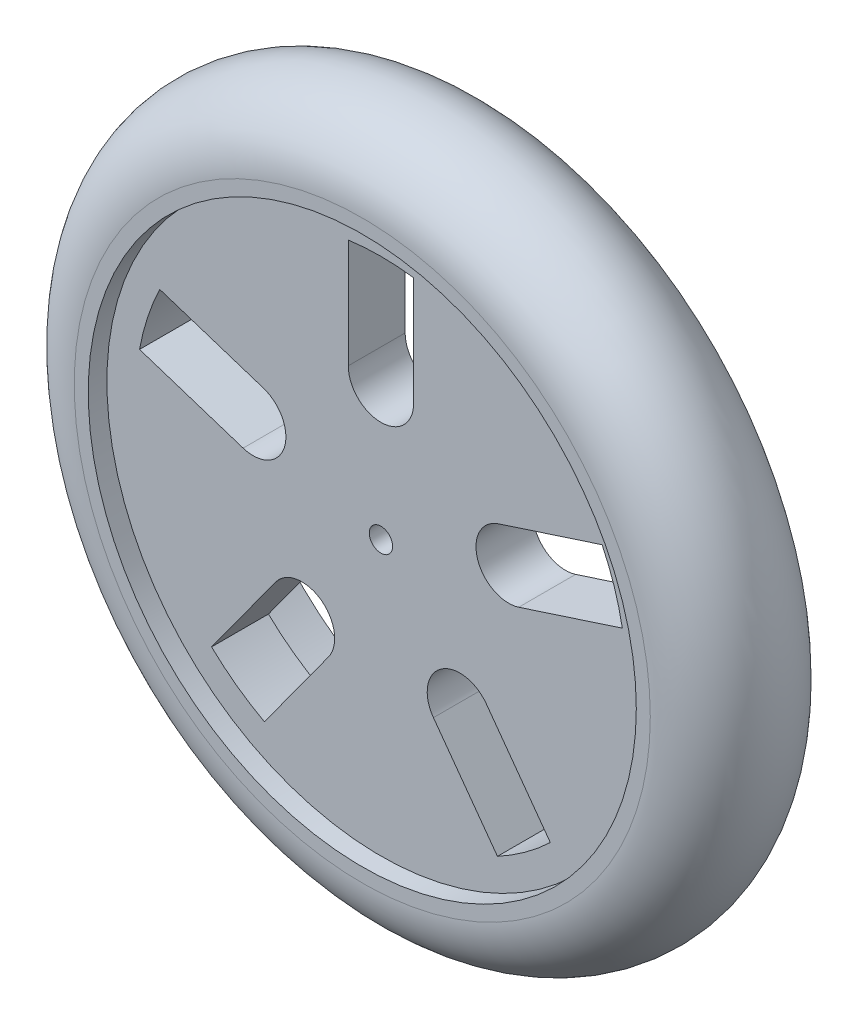
ISO-10303-21;
HEADER;
FILE_DESCRIPTION(('STEP AP214'),'2;1');
FILE_NAME('part.step','',(''),(''),'','','');
FILE_SCHEMA(('AUTOMOTIVE_DESIGN { 1 0 10303 214 1 1 1 1 }'));
ENDSEC;
DATA;
#1=APPLICATION_CONTEXT('core data for automotive mechanical design processes');
#2=APPLICATION_PROTOCOL_DEFINITION('international standard','automotive_design',2000,#1);
#3=PRODUCT_CONTEXT('',#1,'mechanical');
#4=PRODUCT('Part','Part','',(#3));
#5=PRODUCT_RELATED_PRODUCT_CATEGORY('part','',(#4));
#6=PRODUCT_DEFINITION_FORMATION('','',#4);
#7=PRODUCT_DEFINITION_CONTEXT('part definition',#1,'design');
#8=PRODUCT_DEFINITION('design','',#6,#7);
#9=PRODUCT_DEFINITION_SHAPE('','',#8);
#10=(LENGTH_UNIT() NAMED_UNIT(*) SI_UNIT(.MILLI.,.METRE.));
#11=(NAMED_UNIT(*) PLANE_ANGLE_UNIT() SI_UNIT($,.RADIAN.));
#12=(NAMED_UNIT(*) SI_UNIT($,.STERADIAN.) SOLID_ANGLE_UNIT());
#13=UNCERTAINTY_MEASURE_WITH_UNIT(LENGTH_MEASURE(1.E-05),#10,'distance_accuracy_value','');
#14=(GEOMETRIC_REPRESENTATION_CONTEXT(3) GLOBAL_UNCERTAINTY_ASSIGNED_CONTEXT((#13)) GLOBAL_UNIT_ASSIGNED_CONTEXT((#10,
#11,#12)) REPRESENTATION_CONTEXT('',''));
#15=CARTESIAN_POINT('',(0.,0.,0.));
#16=DIRECTION('',(0.,0.,1.));
#17=DIRECTION('',(1.,0.,0.));
#18=AXIS2_PLACEMENT_3D('',#15,#16,#17);
#19=CARTESIAN_POINT('',(0.,0.,-45.339));
#20=DIRECTION('',(0.,0.,1.));
#21=DIRECTION('',(1.,0.,0.));
#22=AXIS2_PLACEMENT_3D('',#19,#20,#21);
#23=CYLINDRICAL_SURFACE('',#22,7.9375);
#24=CARTESIAN_POINT('',(0.,0.,-45.339));
#25=DIRECTION('',(0.,0.,1.));
#26=DIRECTION('',(1.,0.,0.));
#27=AXIS2_PLACEMENT_3D('',#24,#25,#26);
#28=CIRCLE('',#27,7.9375);
#29=CARTESIAN_POINT('',(7.9375,0.,-45.339));
#30=VERTEX_POINT('',#29);
#31=EDGE_CURVE('E339',#30,#30,#28,.T.);
#32=ORIENTED_EDGE('',*,*,#31,.F.);
#33=EDGE_LOOP('',(#32));
#34=FACE_BOUND('',#33,.T.);
#35=CARTESIAN_POINT('',(0.,0.,32.639));
#36=DIRECTION('',(0.,0.,1.));
#37=DIRECTION('',(1.,0.,0.));
#38=AXIS2_PLACEMENT_3D('',#35,#36,#37);
#39=CIRCLE('',#38,7.9375);
#40=CARTESIAN_POINT('',(7.9375,0.,32.639));
#41=VERTEX_POINT('',#40);
#42=EDGE_CURVE('E36',#41,#41,#39,.F.);
#43=ORIENTED_EDGE('',*,*,#42,.F.);
#44=EDGE_LOOP('',(#43));
#45=FACE_BOUND('',#44,.T.);
#46=ADVANCED_FACE('F32',(#34,#45),#23,.F.);
#47=CARTESIAN_POINT('',(0.,195.961,-45.339));
#48=DIRECTION('',(0.,0.,1.));
#49=DIRECTION('',(1.,0.,0.));
#50=AXIS2_PLACEMENT_3D('',#47,#48,#49);
#51=PLANE('',#50);
#52=ORIENTED_EDGE('',*,*,#31,.T.);
#53=EDGE_LOOP('',(#52));
#54=FACE_BOUND('',#53,.T.);
#55=CARTESIAN_POINT('',(0.,0.,-45.339));
#56=DIRECTION('',(0.,0.,-1.));
#57=DIRECTION('',(-1.,0.,0.));
#58=AXIS2_PLACEMENT_3D('',#55,#56,#57);
#59=CIRCLE('',#58,12.7);
#60=CARTESIAN_POINT('',(-12.7,0.,-45.339));
#61=VERTEX_POINT('',#60);
#62=EDGE_CURVE('E333',#61,#61,#59,.T.);
#63=ORIENTED_EDGE('',*,*,#62,.T.);
#64=EDGE_LOOP('',(#63));
#65=FACE_BOUND('',#64,.T.);
#66=ADVANCED_FACE('F352',(#54,#65),#51,.F.);
#67=CARTESIAN_POINT('',(0.,0.,0.));
#68=DIRECTION('',(0.,0.,1.));
#69=DIRECTION('',(1.,0.,0.));
#70=AXIS2_PLACEMENT_3D('',#67,#68,#69);
#71=TOROIDAL_SURFACE('',#70,195.961,45.339);
#72=CARTESIAN_POINT('',(0.,0.,45.339));
#73=DIRECTION('',(0.,0.,1.));
#74=DIRECTION('',(1.,0.,0.));
#75=AXIS2_PLACEMENT_3D('',#72,#73,#74);
#76=CIRCLE('',#75,195.961);
#77=CARTESIAN_POINT('',(195.961,0.,45.339));
#78=VERTEX_POINT('',#77);
#79=EDGE_CURVE('E11',#78,#78,#76,.T.);
#80=ORIENTED_EDGE('',*,*,#79,.F.);
#81=EDGE_LOOP('',(#80));
#82=FACE_BOUND('',#81,.T.);
#83=CARTESIAN_POINT('',(0.,0.,-45.339));
#84=DIRECTION('',(0.,0.,1.));
#85=DIRECTION('',(1.,0.,0.));
#86=AXIS2_PLACEMENT_3D('',#83,#84,#85);
#87=CIRCLE('',#86,195.961);
#88=CARTESIAN_POINT('',(195.961,0.,-45.339));
#89=VERTEX_POINT('',#88);
#90=EDGE_CURVE('E41',#89,#89,#87,.T.);
#91=ORIENTED_EDGE('',*,*,#90,.T.);
#92=EDGE_LOOP('',(#91));
#93=FACE_BOUND('',#92,.T.);
#94=ADVANCED_FACE('F34',(#82,#93),#71,.T.);
#95=CARTESIAN_POINT('',(0.,195.961,45.339));
#96=DIRECTION('',(0.,0.,-1.));
#97=DIRECTION('',(-1.,0.,0.));
#98=AXIS2_PLACEMENT_3D('',#95,#96,#97);
#99=PLANE('',#98);
#100=CARTESIAN_POINT('',(0.,0.,45.339));
#101=DIRECTION('',(0.,0.,1.));
#102=DIRECTION('',(1.,0.,0.));
#103=AXIS2_PLACEMENT_3D('',#100,#101,#102);
#104=CIRCLE('',#103,186.436);
#105=CARTESIAN_POINT('',(186.436,0.,45.339));
#106=VERTEX_POINT('',#105);
#107=EDGE_CURVE('E321',#106,#106,#104,.T.);
#108=ORIENTED_EDGE('',*,*,#107,.F.);
#109=EDGE_LOOP('',(#108));
#110=FACE_BOUND('',#109,.T.);
#111=ORIENTED_EDGE('',*,*,#79,.T.);
#112=EDGE_LOOP('',(#111));
#113=FACE_BOUND('',#112,.T.);
#114=ADVANCED_FACE('F349',(#110,#113),#99,.F.);
#115=CARTESIAN_POINT('',(0.,0.,-45.339));
#116=DIRECTION('',(0.,0.,-1.));
#117=DIRECTION('',(-1.,0.,0.));
#118=AXIS2_PLACEMENT_3D('',#115,#116,#117);
#119=CIRCLE('',#118,186.436);
#120=CARTESIAN_POINT('',(-186.436,0.,-45.339));
#121=VERTEX_POINT('',#120);
#122=EDGE_CURVE('E336',#121,#121,#119,.T.);
#123=ORIENTED_EDGE('',*,*,#122,.F.);
#124=EDGE_LOOP('',(#123));
#125=FACE_BOUND('',#124,.T.);
#126=ORIENTED_EDGE('',*,*,#90,.F.);
#127=EDGE_LOOP('',(#126));
#128=FACE_BOUND('',#127,.T.);
#129=ADVANCED_FACE('F346',(#125,#128),#51,.F.);
#130=CARTESIAN_POINT('',(0.,0.,-33.0454));
#131=DIRECTION('',(0.,0.,-1.));
#132=DIRECTION('',(-1.,0.,0.));
#133=AXIS2_PLACEMENT_3D('',#130,#131,#132);
#134=CYLINDRICAL_SURFACE('',#133,186.436);
#135=ORIENTED_EDGE('',*,*,#122,.T.);
#136=EDGE_LOOP('',(#135));
#137=FACE_BOUND('',#136,.T.);
#138=CARTESIAN_POINT('',(0.,0.,-6.05789999999998));
#139=DIRECTION('',(0.,0.,-1.));
#140=DIRECTION('',(-1.,0.,0.));
#141=AXIS2_PLACEMENT_3D('',#138,#139,#140);
#142=CIRCLE('',#141,186.436);
#143=CARTESIAN_POINT('',(-186.436,0.,-6.05789999999998));
#144=VERTEX_POINT('',#143);
#145=EDGE_CURVE('E330',#144,#144,#142,.T.);
#146=ORIENTED_EDGE('',*,*,#145,.F.);
#147=EDGE_LOOP('',(#146));
#148=FACE_BOUND('',#147,.T.);
#149=ADVANCED_FACE('F348',(#137,#148),#134,.F.);
#150=CARTESIAN_POINT('',(0.,0.,-33.0454));
#151=DIRECTION('',(0.,0.,-1.));
#152=DIRECTION('',(-1.,0.,0.));
#153=AXIS2_PLACEMENT_3D('',#150,#151,#152);
#154=CYLINDRICAL_SURFACE('',#153,12.7);
#155=ORIENTED_EDGE('',*,*,#62,.F.);
#156=EDGE_LOOP('',(#155));
#157=FACE_BOUND('',#156,.T.);
#158=CARTESIAN_POINT('',(0.,0.,-6.05789999999998));
#159=DIRECTION('',(0.,0.,-1.));
#160=DIRECTION('',(-1.,0.,0.));
#161=AXIS2_PLACEMENT_3D('',#158,#159,#160);
#162=CIRCLE('',#161,12.7);
#163=CARTESIAN_POINT('',(-12.7,0.,-6.05789999999998));
#164=VERTEX_POINT('',#163);
#165=EDGE_CURVE('E327',#164,#164,#162,.T.);
#166=ORIENTED_EDGE('',*,*,#165,.T.);
#167=EDGE_LOOP('',(#166));
#168=FACE_BOUND('',#167,.T.);
#169=ADVANCED_FACE('F357',(#157,#168),#154,.T.);
#170=CARTESIAN_POINT('',(0.,0.,-6.05789999999998));
#171=DIRECTION('',(0.,0.,-1.));
#172=DIRECTION('',(-1.,0.,0.));
#173=AXIS2_PLACEMENT_3D('',#170,#171,#172);
#174=PLANE('',#173);
#175=CARTESIAN_POINT('',(-86.8835626075463,28.2301807700767,-6.05789999999998));
#176=DIRECTION('',(0.,0.,-1.));
#177=DIRECTION('',(-1.,0.,0.));
#178=AXIS2_PLACEMENT_3D('',#175,#176,#177);
#179=CIRCLE('',#178,22.225);
#180=CARTESIAN_POINT('',(-80.0156599075631,49.3674118447364,-6.05789999999998));
#181=VERTEX_POINT('',#180);
#182=CARTESIAN_POINT('',(-93.7514653075295,7.09294969541687,-6.05789999999998));
#183=VERTEX_POINT('',#182);
#184=EDGE_CURVE('E203',#181,#183,#179,.T.);
#185=ORIENTED_EDGE('',*,*,#184,.F.);
#186=DIRECTION('',(0.951056516295154,-0.309016994374948,0.));
#187=VECTOR('',#186,1.);
#188=CARTESIAN_POINT('',(6.8679026999832,21.1372310746598,-6.05789999999998));
#189=LINE('',#188,#187);
#190=CARTESIAN_POINT('',(-150.48925524316,72.2656710336192,-6.05789999999998));
#191=VERTEX_POINT('',#190);
#192=EDGE_CURVE('E196',#191,#181,#189,.T.);
#193=ORIENTED_EDGE('',*,*,#192,.F.);
#194=CARTESIAN_POINT('',(0.,0.,-6.05789999999998));
#195=DIRECTION('',(0.,0.,-1.));
#196=DIRECTION('',(-1.,0.,0.));
#197=AXIS2_PLACEMENT_3D('',#194,#195,#196);
#198=CIRCLE('',#197,166.941136792524);
#199=CARTESIAN_POINT('',(-164.225060643126,29.9912088842997,-6.05789999999998));
#200=VERTEX_POINT('',#199);
#201=EDGE_CURVE('E176',#200,#191,#198,.T.);
#202=ORIENTED_EDGE('',*,*,#201,.F.);
#203=DIRECTION('',(-0.951056516295154,0.309016994374948,0.));
#204=VECTOR('',#203,1.);
#205=CARTESIAN_POINT('',(-6.86790269998321,-21.1372310746598,-6.05789999999998));
#206=LINE('',#205,#204);
#207=EDGE_CURVE('E201',#183,#200,#206,.T.);
#208=ORIENTED_EDGE('',*,*,#207,.F.);
#209=EDGE_LOOP('',(#185,#193,#202,#208));
#210=FACE_BOUND('',#209,.T.);
#211=CARTESIAN_POINT('',(-53.6969947551431,-73.9075727646144,-6.05789999999998));
#212=DIRECTION('',(0.,0.,-1.));
#213=DIRECTION('',(-1.,0.,0.));
#214=AXIS2_PLACEMENT_3D('',#211,#212,#213);
#215=CIRCLE('',#214,22.225);
#216=CARTESIAN_POINT('',(-71.6773974551263,-60.8440455324142,-6.05789999999998));
#217=VERTEX_POINT('',#216);
#218=CARTESIAN_POINT('',(-35.7165920551598,-86.9710999968146,-6.05789999999998));
#219=VERTEX_POINT('',#218);
#220=EDGE_CURVE('E232',#217,#219,#215,.T.);
#221=ORIENTED_EDGE('',*,*,#220,.F.);
#222=DIRECTION('',(0.587785252292473,0.809016994374948,0.));
#223=VECTOR('',#222,1.);
#224=CARTESIAN_POINT('',(-17.9804026999832,13.0635272322002,-6.05789999999998));
#225=LINE('',#224,#223);
#226=CARTESIAN_POINT('',(-115.232474681931,-120.792466372114,-6.05789999999998));
#227=VERTEX_POINT('',#226);
#228=EDGE_CURVE('E219',#227,#217,#225,.T.);
#229=ORIENTED_EDGE('',*,*,#228,.F.);
#230=CARTESIAN_POINT('',(0.,0.,-6.05789999999998));
#231=DIRECTION('',(0.,0.,-1.));
#232=DIRECTION('',(-1.,0.,0.));
#233=AXIS2_PLACEMENT_3D('',#230,#231,#232);
#234=CIRCLE('',#233,166.941136792524);
#235=CARTESIAN_POINT('',(-79.2716692819646,-146.919520836514,-6.05789999999998));
#236=VERTEX_POINT('',#235);
#237=EDGE_CURVE('E227',#236,#227,#234,.T.);
#238=ORIENTED_EDGE('',*,*,#237,.F.);
#239=DIRECTION('',(-0.587785252292473,-0.809016994374947,0.));
#240=VECTOR('',#239,1.);
#241=CARTESIAN_POINT('',(17.9804026999832,-13.0635272322002,-6.05789999999998));
#242=LINE('',#241,#240);
#243=EDGE_CURVE('E230',#219,#236,#242,.T.);
#244=ORIENTED_EDGE('',*,*,#243,.F.);
#245=EDGE_LOOP('',(#221,#229,#238,#244));
#246=FACE_BOUND('',#245,.T.);
#247=CARTESIAN_POINT('',(53.6969947551431,-73.9075727646143,-6.05789999999998));
#248=DIRECTION('',(0.,0.,-1.));
#249=DIRECTION('',(-1.,0.,0.));
#250=AXIS2_PLACEMENT_3D('',#247,#248,#249);
#251=CIRCLE('',#250,22.225);
#252=CARTESIAN_POINT('',(35.7165920551599,-86.9710999968146,-6.05789999999998));
#253=VERTEX_POINT('',#252);
#254=CARTESIAN_POINT('',(71.6773974551263,-60.8440455324141,-6.05789999999998));
#255=VERTEX_POINT('',#254);
#256=EDGE_CURVE('E261',#253,#255,#251,.T.);
#257=ORIENTED_EDGE('',*,*,#256,.F.);
#258=DIRECTION('',(-0.587785252292473,0.809016994374947,0.));
#259=VECTOR('',#258,1.);
#260=CARTESIAN_POINT('',(-17.9804026999832,-13.0635272322002,-6.05789999999998));
#261=LINE('',#260,#259);
#262=CARTESIAN_POINT('',(79.2716692819646,-146.919520836514,-6.05789999999998));
#263=VERTEX_POINT('',#262);
#264=EDGE_CURVE('E248',#263,#253,#261,.T.);
#265=ORIENTED_EDGE('',*,*,#264,.F.);
#266=CARTESIAN_POINT('',(0.,0.,-6.05789999999998));
#267=DIRECTION('',(0.,0.,-1.));
#268=DIRECTION('',(-1.,0.,0.));
#269=AXIS2_PLACEMENT_3D('',#266,#267,#268);
#270=CIRCLE('',#269,166.941136792524);
#271=CARTESIAN_POINT('',(115.232474681931,-120.792466372114,-6.05789999999998));
#272=VERTEX_POINT('',#271);
#273=EDGE_CURVE('E256',#272,#263,#270,.T.);
#274=ORIENTED_EDGE('',*,*,#273,.F.);
#275=DIRECTION('',(0.587785252292473,-0.809016994374948,0.));
#276=VECTOR('',#275,1.);
#277=CARTESIAN_POINT('',(17.9804026999832,13.0635272322002,-6.05789999999998));
#278=LINE('',#277,#276);
#279=EDGE_CURVE('E259',#255,#272,#278,.T.);
#280=ORIENTED_EDGE('',*,*,#279,.F.);
#281=EDGE_LOOP('',(#257,#265,#274,#280));
#282=FACE_BOUND('',#281,.T.);
#283=CARTESIAN_POINT('',(86.8835626075463,28.2301807700766,-6.05789999999998));
#284=DIRECTION('',(0.,0.,-1.));
#285=DIRECTION('',(-1.,0.,0.));
#286=AXIS2_PLACEMENT_3D('',#283,#284,#285);
#287=CIRCLE('',#286,22.225);
#288=CARTESIAN_POINT('',(93.7514653075295,7.09294969541687,-6.05789999999998));
#289=VERTEX_POINT('',#288);
#290=CARTESIAN_POINT('',(80.0156599075631,49.3674118447364,-6.05789999999998));
#291=VERTEX_POINT('',#290);
#292=EDGE_CURVE('E290',#289,#291,#287,.T.);
#293=ORIENTED_EDGE('',*,*,#292,.F.);
#294=DIRECTION('',(-0.951056516295154,-0.309016994374948,0.));
#295=VECTOR('',#294,1.);
#296=CARTESIAN_POINT('',(6.86790269998321,-21.1372310746598,-6.05789999999998));
#297=LINE('',#296,#295);
#298=CARTESIAN_POINT('',(164.225060643126,29.9912088842997,-6.05789999999998));
#299=VERTEX_POINT('',#298);
#300=EDGE_CURVE('E277',#299,#289,#297,.T.);
#301=ORIENTED_EDGE('',*,*,#300,.F.);
#302=CARTESIAN_POINT('',(0.,0.,-6.05789999999998));
#303=DIRECTION('',(0.,0.,-1.));
#304=DIRECTION('',(-1.,0.,0.));
#305=AXIS2_PLACEMENT_3D('',#302,#303,#304);
#306=CIRCLE('',#305,166.941136792524);
#307=CARTESIAN_POINT('',(150.48925524316,72.2656710336193,-6.05789999999998));
#308=VERTEX_POINT('',#307);
#309=EDGE_CURVE('E285',#308,#299,#306,.T.);
#310=ORIENTED_EDGE('',*,*,#309,.F.);
#311=DIRECTION('',(0.951056516295154,0.309016994374948,0.));
#312=VECTOR('',#311,1.);
#313=CARTESIAN_POINT('',(-6.8679026999832,21.1372310746598,-6.05789999999998));
#314=LINE('',#313,#312);
#315=EDGE_CURVE('E288',#291,#308,#314,.T.);
#316=ORIENTED_EDGE('',*,*,#315,.F.);
#317=EDGE_LOOP('',(#293,#301,#310,#316));
#318=FACE_BOUND('',#317,.T.);
#319=CARTESIAN_POINT('',(0.,91.3547839890754,-6.05789999999998));
#320=DIRECTION('',(0.,0.,-1.));
#321=DIRECTION('',(-1.,0.,0.));
#322=AXIS2_PLACEMENT_3D('',#319,#320,#321);
#323=CIRCLE('',#322,22.225);
#324=CARTESIAN_POINT('',(22.225,91.3547839890754,-6.05789999999998));
#325=VERTEX_POINT('',#324);
#326=CARTESIAN_POINT('',(-22.225,91.3547839890754,-6.05789999999998));
#327=VERTEX_POINT('',#326);
#328=EDGE_CURVE('E319',#325,#327,#323,.T.);
#329=ORIENTED_EDGE('',*,*,#328,.F.);
#330=DIRECTION('',(0.,-1.,0.));
#331=VECTOR('',#330,1.);
#332=CARTESIAN_POINT('',(22.225,0.,-6.05789999999998));
#333=LINE('',#332,#331);
#334=CARTESIAN_POINT('',(22.225,165.455107290709,-6.05789999999998));
#335=VERTEX_POINT('',#334);
#336=EDGE_CURVE('E306',#335,#325,#333,.T.);
#337=ORIENTED_EDGE('',*,*,#336,.F.);
#338=CARTESIAN_POINT('',(0.,0.,-6.05789999999998));
#339=DIRECTION('',(0.,0.,-1.));
#340=DIRECTION('',(-1.,0.,0.));
#341=AXIS2_PLACEMENT_3D('',#338,#339,#340);
#342=CIRCLE('',#341,166.941136792524);
#343=CARTESIAN_POINT('',(-22.225,165.455107290709,-6.05789999999998));
#344=VERTEX_POINT('',#343);
#345=EDGE_CURVE('E314',#344,#335,#342,.T.);
#346=ORIENTED_EDGE('',*,*,#345,.F.);
#347=DIRECTION('',(0.,1.,0.));
#348=VECTOR('',#347,1.);
#349=CARTESIAN_POINT('',(-22.225,0.,-6.05789999999998));
#350=LINE('',#349,#348);
#351=EDGE_CURVE('E317',#327,#344,#350,.T.);
#352=ORIENTED_EDGE('',*,*,#351,.F.);
#353=EDGE_LOOP('',(#329,#337,#346,#352));
#354=FACE_BOUND('',#353,.T.);
#355=ORIENTED_EDGE('',*,*,#165,.F.);
#356=EDGE_LOOP('',(#355));
#357=FACE_BOUND('',#356,.T.);
#358=ORIENTED_EDGE('',*,*,#145,.T.);
#359=EDGE_LOOP('',(#358));
#360=FACE_BOUND('',#359,.T.);
#361=ADVANCED_FACE('F374',(#210,#246,#282,#318,#354,#357,#360),#174,.T.);
#362=CARTESIAN_POINT('',(0.,0.,32.639));
#363=DIRECTION('',(0.,0.,1.));
#364=DIRECTION('',(1.,0.,0.));
#365=AXIS2_PLACEMENT_3D('',#362,#363,#364);
#366=PLANE('',#365);
#367=CARTESIAN_POINT('',(-86.8835626075463,28.2301807700767,32.639));
#368=DIRECTION('',(0.,0.,1.));
#369=DIRECTION('',(1.,0.,0.));
#370=AXIS2_PLACEMENT_3D('',#367,#368,#369);
#371=CIRCLE('',#370,22.225);
#372=CARTESIAN_POINT('',(-93.7514653075295,7.09294969541687,32.639));
#373=VERTEX_POINT('',#372);
#374=CARTESIAN_POINT('',(-80.0156599075631,49.3674118447364,32.639));
#375=VERTEX_POINT('',#374);
#376=EDGE_CURVE('E56',#373,#375,#371,.T.);
#377=ORIENTED_EDGE('',*,*,#376,.F.);
#378=DIRECTION('',(0.951056516295154,-0.309016994374948,0.));
#379=VECTOR('',#378,1.);
#380=CARTESIAN_POINT('',(-164.225060643126,29.9912088842997,32.639));
#381=LINE('',#380,#379);
#382=CARTESIAN_POINT('',(-164.225060643126,29.9912088842997,32.639));
#383=VERTEX_POINT('',#382);
#384=EDGE_CURVE('E189',#383,#373,#381,.T.);
#385=ORIENTED_EDGE('',*,*,#384,.F.);
#386=CARTESIAN_POINT('',(0.,0.,32.639));
#387=DIRECTION('',(0.,0.,1.));
#388=DIRECTION('',(1.,0.,0.));
#389=AXIS2_PLACEMENT_3D('',#386,#387,#388);
#390=CIRCLE('',#389,166.941136792524);
#391=CARTESIAN_POINT('',(-150.48925524316,72.2656710336193,32.639));
#392=VERTEX_POINT('',#391);
#393=EDGE_CURVE('E173',#392,#383,#390,.T.);
#394=ORIENTED_EDGE('',*,*,#393,.F.);
#395=DIRECTION('',(-0.951056516295154,0.309016994374948,0.));
#396=VECTOR('',#395,1.);
#397=CARTESIAN_POINT('',(-150.48925524316,72.2656710336193,32.639));
#398=LINE('',#397,#396);
#399=EDGE_CURVE('E182',#375,#392,#398,.T.);
#400=ORIENTED_EDGE('',*,*,#399,.F.);
#401=EDGE_LOOP('',(#377,#385,#394,#400));
#402=FACE_BOUND('',#401,.T.);
#403=CARTESIAN_POINT('',(-53.6969947551431,-73.9075727646144,32.639));
#404=DIRECTION('',(0.,0.,1.));
#405=DIRECTION('',(1.,0.,0.));
#406=AXIS2_PLACEMENT_3D('',#403,#404,#405);
#407=CIRCLE('',#406,22.225);
#408=CARTESIAN_POINT('',(-35.7165920551598,-86.9710999968146,32.639));
#409=VERTEX_POINT('',#408);
#410=CARTESIAN_POINT('',(-71.6773974551263,-60.8440455324142,32.639));
#411=VERTEX_POINT('',#410);
#412=EDGE_CURVE('E205',#409,#411,#407,.T.);
#413=ORIENTED_EDGE('',*,*,#412,.F.);
#414=DIRECTION('',(0.587785252292473,0.809016994374947,0.));
#415=VECTOR('',#414,1.);
#416=CARTESIAN_POINT('',(-79.2716692819646,-146.919520836514,32.639));
#417=LINE('',#416,#415);
#418=CARTESIAN_POINT('',(-79.2716692819646,-146.919520836514,32.639));
#419=VERTEX_POINT('',#418);
#420=EDGE_CURVE('E213',#419,#409,#417,.T.);
#421=ORIENTED_EDGE('',*,*,#420,.F.);
#422=CARTESIAN_POINT('',(0.,0.,32.639));
#423=DIRECTION('',(0.,0.,1.));
#424=DIRECTION('',(1.,0.,0.));
#425=AXIS2_PLACEMENT_3D('',#422,#423,#424);
#426=CIRCLE('',#425,166.941136792524);
#427=CARTESIAN_POINT('',(-115.232474681931,-120.792466372114,32.639));
#428=VERTEX_POINT('',#427);
#429=EDGE_CURVE('E210',#428,#419,#426,.T.);
#430=ORIENTED_EDGE('',*,*,#429,.F.);
#431=DIRECTION('',(-0.587785252292473,-0.809016994374947,0.));
#432=VECTOR('',#431,1.);
#433=CARTESIAN_POINT('',(-115.232474681931,-120.792466372114,32.639));
#434=LINE('',#433,#432);
#435=EDGE_CURVE('E207',#411,#428,#434,.T.);
#436=ORIENTED_EDGE('',*,*,#435,.F.);
#437=EDGE_LOOP('',(#413,#421,#430,#436));
#438=FACE_BOUND('',#437,.T.);
#439=CARTESIAN_POINT('',(53.6969947551431,-73.9075727646143,32.639));
#440=DIRECTION('',(0.,0.,1.));
#441=DIRECTION('',(1.,0.,0.));
#442=AXIS2_PLACEMENT_3D('',#439,#440,#441);
#443=CIRCLE('',#442,22.225);
#444=CARTESIAN_POINT('',(71.6773974551263,-60.8440455324141,32.639));
#445=VERTEX_POINT('',#444);
#446=CARTESIAN_POINT('',(35.7165920551599,-86.9710999968145,32.639));
#447=VERTEX_POINT('',#446);
#448=EDGE_CURVE('E234',#445,#447,#443,.T.);
#449=ORIENTED_EDGE('',*,*,#448,.F.);
#450=DIRECTION('',(-0.587785252292473,0.809016994374947,0.));
#451=VECTOR('',#450,1.);
#452=CARTESIAN_POINT('',(115.232474681931,-120.792466372114,32.639));
#453=LINE('',#452,#451);
#454=CARTESIAN_POINT('',(115.232474681931,-120.792466372114,32.639));
#455=VERTEX_POINT('',#454);
#456=EDGE_CURVE('E242',#455,#445,#453,.T.);
#457=ORIENTED_EDGE('',*,*,#456,.F.);
#458=CARTESIAN_POINT('',(0.,0.,32.639));
#459=DIRECTION('',(0.,0.,1.));
#460=DIRECTION('',(1.,0.,0.));
#461=AXIS2_PLACEMENT_3D('',#458,#459,#460);
#462=CIRCLE('',#461,166.941136792524);
#463=CARTESIAN_POINT('',(79.2716692819646,-146.919520836514,32.639));
#464=VERTEX_POINT('',#463);
#465=EDGE_CURVE('E239',#464,#455,#462,.T.);
#466=ORIENTED_EDGE('',*,*,#465,.F.);
#467=DIRECTION('',(0.587785252292473,-0.809016994374947,0.));
#468=VECTOR('',#467,1.);
#469=CARTESIAN_POINT('',(79.2716692819646,-146.919520836514,32.639));
#470=LINE('',#469,#468);
#471=EDGE_CURVE('E236',#447,#464,#470,.T.);
#472=ORIENTED_EDGE('',*,*,#471,.F.);
#473=EDGE_LOOP('',(#449,#457,#466,#472));
#474=FACE_BOUND('',#473,.T.);
#475=CARTESIAN_POINT('',(86.8835626075463,28.2301807700766,32.639));
#476=DIRECTION('',(0.,0.,1.));
#477=DIRECTION('',(1.,0.,0.));
#478=AXIS2_PLACEMENT_3D('',#475,#476,#477);
#479=CIRCLE('',#478,22.225);
#480=CARTESIAN_POINT('',(80.0156599075631,49.3674118447364,32.639));
#481=VERTEX_POINT('',#480);
#482=CARTESIAN_POINT('',(93.7514653075295,7.09294969541686,32.639));
#483=VERTEX_POINT('',#482);
#484=EDGE_CURVE('E263',#481,#483,#479,.T.);
#485=ORIENTED_EDGE('',*,*,#484,.F.);
#486=DIRECTION('',(-0.951056516295154,-0.309016994374948,0.));
#487=VECTOR('',#486,1.);
#488=CARTESIAN_POINT('',(150.48925524316,72.2656710336193,32.639));
#489=LINE('',#488,#487);
#490=CARTESIAN_POINT('',(150.48925524316,72.2656710336193,32.639));
#491=VERTEX_POINT('',#490);
#492=EDGE_CURVE('E271',#491,#481,#489,.T.);
#493=ORIENTED_EDGE('',*,*,#492,.F.);
#494=CARTESIAN_POINT('',(0.,0.,32.639));
#495=DIRECTION('',(0.,0.,1.));
#496=DIRECTION('',(1.,0.,0.));
#497=AXIS2_PLACEMENT_3D('',#494,#495,#496);
#498=CIRCLE('',#497,166.941136792524);
#499=CARTESIAN_POINT('',(164.225060643126,29.9912088842997,32.639));
#500=VERTEX_POINT('',#499);
#501=EDGE_CURVE('E268',#500,#491,#498,.T.);
#502=ORIENTED_EDGE('',*,*,#501,.F.);
#503=DIRECTION('',(0.951056516295154,0.309016994374948,0.));
#504=VECTOR('',#503,1.);
#505=CARTESIAN_POINT('',(164.225060643126,29.9912088842997,32.639));
#506=LINE('',#505,#504);
#507=EDGE_CURVE('E265',#483,#500,#506,.T.);
#508=ORIENTED_EDGE('',*,*,#507,.F.);
#509=EDGE_LOOP('',(#485,#493,#502,#508));
#510=FACE_BOUND('',#509,.T.);
#511=CARTESIAN_POINT('',(0.,91.3547839890754,32.639));
#512=DIRECTION('',(0.,0.,1.));
#513=DIRECTION('',(1.,0.,0.));
#514=AXIS2_PLACEMENT_3D('',#511,#512,#513);
#515=CIRCLE('',#514,22.225);
#516=CARTESIAN_POINT('',(-22.225,91.3547839890754,32.639));
#517=VERTEX_POINT('',#516);
#518=CARTESIAN_POINT('',(22.225,91.3547839890754,32.639));
#519=VERTEX_POINT('',#518);
#520=EDGE_CURVE('E292',#517,#519,#515,.T.);
#521=ORIENTED_EDGE('',*,*,#520,.F.);
#522=DIRECTION('',(0.,-1.,0.));
#523=VECTOR('',#522,1.);
#524=CARTESIAN_POINT('',(-22.225,165.455107290709,32.639));
#525=LINE('',#524,#523);
#526=CARTESIAN_POINT('',(-22.225,165.455107290709,32.639));
#527=VERTEX_POINT('',#526);
#528=EDGE_CURVE('E300',#527,#517,#525,.T.);
#529=ORIENTED_EDGE('',*,*,#528,.F.);
#530=CARTESIAN_POINT('',(0.,0.,32.639));
#531=DIRECTION('',(0.,0.,1.));
#532=DIRECTION('',(1.,0.,0.));
#533=AXIS2_PLACEMENT_3D('',#530,#531,#532);
#534=CIRCLE('',#533,166.941136792524);
#535=CARTESIAN_POINT('',(22.225,165.455107290709,32.639));
#536=VERTEX_POINT('',#535);
#537=EDGE_CURVE('E297',#536,#527,#534,.T.);
#538=ORIENTED_EDGE('',*,*,#537,.F.);
#539=DIRECTION('',(0.,1.,0.));
#540=VECTOR('',#539,1.);
#541=CARTESIAN_POINT('',(22.225,165.455107290709,32.639));
#542=LINE('',#541,#540);
#543=EDGE_CURVE('E294',#519,#536,#542,.T.);
#544=ORIENTED_EDGE('',*,*,#543,.F.);
#545=EDGE_LOOP('',(#521,#529,#538,#544));
#546=FACE_BOUND('',#545,.T.);
#547=CARTESIAN_POINT('',(0.,0.,32.639));
#548=DIRECTION('',(0.,0.,1.));
#549=DIRECTION('',(1.,0.,0.));
#550=AXIS2_PLACEMENT_3D('',#547,#548,#549);
#551=CIRCLE('',#550,186.436);
#552=CARTESIAN_POINT('',(186.436,0.,32.639));
#553=VERTEX_POINT('',#552);
#554=EDGE_CURVE('E322',#553,#553,#551,.T.);
#555=ORIENTED_EDGE('',*,*,#554,.T.);
#556=EDGE_LOOP('',(#555));
#557=FACE_BOUND('',#556,.T.);
#558=ORIENTED_EDGE('',*,*,#42,.T.);
#559=EDGE_LOOP('',(#558));
#560=FACE_BOUND('',#559,.T.);
#561=ADVANCED_FACE('F186',(#402,#438,#474,#510,#546,#557,#560),#366,.T.);
#562=CARTESIAN_POINT('',(0.,0.,32.639));
#563=DIRECTION('',(0.,0.,1.));
#564=DIRECTION('',(1.,0.,0.));
#565=AXIS2_PLACEMENT_3D('',#562,#563,#564);
#566=CYLINDRICAL_SURFACE('',#565,186.436);
#567=ORIENTED_EDGE('',*,*,#554,.F.);
#568=EDGE_LOOP('',(#567));
#569=FACE_BOUND('',#568,.T.);
#570=ORIENTED_EDGE('',*,*,#107,.T.);
#571=EDGE_LOOP('',(#570));
#572=FACE_BOUND('',#571,.T.);
#573=ADVANCED_FACE('F379',(#569,#572),#566,.F.);
#574=CARTESIAN_POINT('',(0.,91.3547839890754,-45.339));
#575=DIRECTION('',(0.,0.,1.));
#576=DIRECTION('',(1.,0.,0.));
#577=AXIS2_PLACEMENT_3D('',#574,#575,#576);
#578=CYLINDRICAL_SURFACE('',#577,22.225);
#579=ORIENTED_EDGE('',*,*,#328,.T.);
#580=DIRECTION('',(0.,0.,1.));
#581=VECTOR('',#580,1.);
#582=CARTESIAN_POINT('',(-22.225,91.3547839890754,-45.339));
#583=LINE('',#582,#581);
#584=EDGE_CURVE('E304',#327,#517,#583,.T.);
#585=ORIENTED_EDGE('',*,*,#584,.T.);
#586=ORIENTED_EDGE('',*,*,#520,.T.);
#587=DIRECTION('',(0.,0.,1.));
#588=VECTOR('',#587,1.);
#589=CARTESIAN_POINT('',(22.225,91.3547839890754,-45.339));
#590=LINE('',#589,#588);
#591=EDGE_CURVE('E303',#325,#519,#590,.T.);
#592=ORIENTED_EDGE('',*,*,#591,.F.);
#593=EDGE_LOOP('',(#579,#585,#586,#592));
#594=FACE_BOUND('',#593,.T.);
#595=ADVANCED_FACE('F382',(#594),#578,.F.);
#596=CARTESIAN_POINT('',(-22.225,165.455107290709,-45.339));
#597=DIRECTION('',(-1.,0.,0.));
#598=DIRECTION('',(0.,0.,1.));
#599=AXIS2_PLACEMENT_3D('',#596,#597,#598);
#600=PLANE('',#599);
#601=ORIENTED_EDGE('',*,*,#351,.T.);
#602=DIRECTION('',(0.,0.,1.));
#603=VECTOR('',#602,1.);
#604=CARTESIAN_POINT('',(-22.225,165.455107290709,-45.339));
#605=LINE('',#604,#603);
#606=EDGE_CURVE('E307',#344,#527,#605,.T.);
#607=ORIENTED_EDGE('',*,*,#606,.T.);
#608=ORIENTED_EDGE('',*,*,#528,.T.);
#609=ORIENTED_EDGE('',*,*,#584,.F.);
#610=EDGE_LOOP('',(#601,#607,#608,#609));
#611=FACE_BOUND('',#610,.T.);
#612=ADVANCED_FACE('F388',(#611),#600,.F.);
#613=CARTESIAN_POINT('',(0.,0.,-45.339));
#614=DIRECTION('',(0.,0.,1.));
#615=DIRECTION('',(1.,0.,0.));
#616=AXIS2_PLACEMENT_3D('',#613,#614,#615);
#617=CYLINDRICAL_SURFACE('',#616,166.941136792524);
#618=ORIENTED_EDGE('',*,*,#345,.T.);
#619=DIRECTION('',(0.,0.,1.));
#620=VECTOR('',#619,1.);
#621=CARTESIAN_POINT('',(22.225,165.455107290709,-45.339));
#622=LINE('',#621,#620);
#623=EDGE_CURVE('E309',#335,#536,#622,.T.);
#624=ORIENTED_EDGE('',*,*,#623,.T.);
#625=ORIENTED_EDGE('',*,*,#537,.T.);
#626=ORIENTED_EDGE('',*,*,#606,.F.);
#627=EDGE_LOOP('',(#618,#624,#625,#626));
#628=FACE_BOUND('',#627,.T.);
#629=ADVANCED_FACE('F394',(#628),#617,.F.);
#630=CARTESIAN_POINT('',(22.225,165.455107290709,-45.339));
#631=DIRECTION('',(1.,0.,0.));
#632=DIRECTION('',(0.,0.,-1.));
#633=AXIS2_PLACEMENT_3D('',#630,#631,#632);
#634=PLANE('',#633);
#635=ORIENTED_EDGE('',*,*,#336,.T.);
#636=ORIENTED_EDGE('',*,*,#591,.T.);
#637=ORIENTED_EDGE('',*,*,#543,.T.);
#638=ORIENTED_EDGE('',*,*,#623,.F.);
#639=EDGE_LOOP('',(#635,#636,#637,#638));
#640=FACE_BOUND('',#639,.T.);
#641=ADVANCED_FACE('F390',(#640),#634,.F.);
#642=CARTESIAN_POINT('',(86.8835626075463,28.2301807700766,-45.339));
#643=DIRECTION('',(0.,0.,1.));
#644=DIRECTION('',(1.,0.,0.));
#645=AXIS2_PLACEMENT_3D('',#642,#643,#644);
#646=CYLINDRICAL_SURFACE('',#645,22.225);
#647=ORIENTED_EDGE('',*,*,#292,.T.);
#648=DIRECTION('',(0.,0.,1.));
#649=VECTOR('',#648,1.);
#650=CARTESIAN_POINT('',(80.0156599075631,49.3674118447364,-45.339));
#651=LINE('',#650,#649);
#652=EDGE_CURVE('E275',#291,#481,#651,.T.);
#653=ORIENTED_EDGE('',*,*,#652,.T.);
#654=ORIENTED_EDGE('',*,*,#484,.T.);
#655=DIRECTION('',(0.,0.,1.));
#656=VECTOR('',#655,1.);
#657=CARTESIAN_POINT('',(93.7514653075295,7.09294969541687,-45.339));
#658=LINE('',#657,#656);
#659=EDGE_CURVE('E274',#289,#483,#658,.T.);
#660=ORIENTED_EDGE('',*,*,#659,.F.);
#661=EDGE_LOOP('',(#647,#653,#654,#660));
#662=FACE_BOUND('',#661,.T.);
#663=ADVANCED_FACE('F393',(#662),#646,.F.);
#664=CARTESIAN_POINT('',(150.48925524316,72.2656710336193,-45.339));
#665=DIRECTION('',(-0.309016994374948,0.951056516295154,0.));
#666=DIRECTION('',(-0.951056516295154,-0.309016994374948,0.));
#667=AXIS2_PLACEMENT_3D('',#664,#665,#666);
#668=PLANE('',#667);
#669=ORIENTED_EDGE('',*,*,#315,.T.);
#670=DIRECTION('',(0.,0.,1.));
#671=VECTOR('',#670,1.);
#672=CARTESIAN_POINT('',(150.48925524316,72.2656710336193,-45.339));
#673=LINE('',#672,#671);
#674=EDGE_CURVE('E278',#308,#491,#673,.T.);
#675=ORIENTED_EDGE('',*,*,#674,.T.);
#676=ORIENTED_EDGE('',*,*,#492,.T.);
#677=ORIENTED_EDGE('',*,*,#652,.F.);
#678=EDGE_LOOP('',(#669,#675,#676,#677));
#679=FACE_BOUND('',#678,.T.);
#680=ADVANCED_FACE('F404',(#679),#668,.F.);
#681=CARTESIAN_POINT('',(0.,0.,-45.339));
#682=DIRECTION('',(0.,0.,1.));
#683=DIRECTION('',(1.,0.,0.));
#684=AXIS2_PLACEMENT_3D('',#681,#682,#683);
#685=CYLINDRICAL_SURFACE('',#684,166.941136792524);
#686=ORIENTED_EDGE('',*,*,#309,.T.);
#687=DIRECTION('',(0.,0.,1.));
#688=VECTOR('',#687,1.);
#689=CARTESIAN_POINT('',(164.225060643126,29.9912088842997,-45.339));
#690=LINE('',#689,#688);
#691=EDGE_CURVE('E280',#299,#500,#690,.T.);
#692=ORIENTED_EDGE('',*,*,#691,.T.);
#693=ORIENTED_EDGE('',*,*,#501,.T.);
#694=ORIENTED_EDGE('',*,*,#674,.F.);
#695=EDGE_LOOP('',(#686,#692,#693,#694));
#696=FACE_BOUND('',#695,.T.);
#697=ADVANCED_FACE('F410',(#696),#685,.F.);
#698=CARTESIAN_POINT('',(164.225060643126,29.9912088842997,-45.339));
#699=DIRECTION('',(0.309016994374947,-0.951056516295154,0.));
#700=DIRECTION('',(0.951056516295154,0.309016994374948,0.));
#701=AXIS2_PLACEMENT_3D('',#698,#699,#700);
#702=PLANE('',#701);
#703=ORIENTED_EDGE('',*,*,#300,.T.);
#704=ORIENTED_EDGE('',*,*,#659,.T.);
#705=ORIENTED_EDGE('',*,*,#507,.T.);
#706=ORIENTED_EDGE('',*,*,#691,.F.);
#707=EDGE_LOOP('',(#703,#704,#705,#706));
#708=FACE_BOUND('',#707,.T.);
#709=ADVANCED_FACE('F406',(#708),#702,.F.);
#710=CARTESIAN_POINT('',(53.6969947551431,-73.9075727646143,-45.339));
#711=DIRECTION('',(0.,0.,1.));
#712=DIRECTION('',(1.,0.,0.));
#713=AXIS2_PLACEMENT_3D('',#710,#711,#712);
#714=CYLINDRICAL_SURFACE('',#713,22.225);
#715=ORIENTED_EDGE('',*,*,#256,.T.);
#716=DIRECTION('',(0.,0.,1.));
#717=VECTOR('',#716,1.);
#718=CARTESIAN_POINT('',(71.6773974551263,-60.8440455324141,-45.339));
#719=LINE('',#718,#717);
#720=EDGE_CURVE('E246',#255,#445,#719,.T.);
#721=ORIENTED_EDGE('',*,*,#720,.T.);
#722=ORIENTED_EDGE('',*,*,#448,.T.);
#723=DIRECTION('',(0.,0.,1.));
#724=VECTOR('',#723,1.);
#725=CARTESIAN_POINT('',(35.7165920551599,-86.9710999968146,-45.339));
#726=LINE('',#725,#724);
#727=EDGE_CURVE('E245',#253,#447,#726,.T.);
#728=ORIENTED_EDGE('',*,*,#727,.F.);
#729=EDGE_LOOP('',(#715,#721,#722,#728));
#730=FACE_BOUND('',#729,.T.);
#731=ADVANCED_FACE('F409',(#730),#714,.F.);
#732=CARTESIAN_POINT('',(115.232474681931,-120.792466372114,-45.339));
#733=DIRECTION('',(0.809016994374947,0.587785252292473,0.));
#734=DIRECTION('',(-0.587785252292473,0.809016994374948,0.));
#735=AXIS2_PLACEMENT_3D('',#732,#733,#734);
#736=PLANE('',#735);
#737=ORIENTED_EDGE('',*,*,#279,.T.);
#738=DIRECTION('',(0.,0.,1.));
#739=VECTOR('',#738,1.);
#740=CARTESIAN_POINT('',(115.232474681931,-120.792466372114,-45.339));
#741=LINE('',#740,#739);
#742=EDGE_CURVE('E249',#272,#455,#741,.T.);
#743=ORIENTED_EDGE('',*,*,#742,.T.);
#744=ORIENTED_EDGE('',*,*,#456,.T.);
#745=ORIENTED_EDGE('',*,*,#720,.F.);
#746=EDGE_LOOP('',(#737,#743,#744,#745));
#747=FACE_BOUND('',#746,.T.);
#748=ADVANCED_FACE('F420',(#747),#736,.F.);
#749=CARTESIAN_POINT('',(0.,0.,-45.339));
#750=DIRECTION('',(0.,0.,1.));
#751=DIRECTION('',(1.,0.,0.));
#752=AXIS2_PLACEMENT_3D('',#749,#750,#751);
#753=CYLINDRICAL_SURFACE('',#752,166.941136792524);
#754=ORIENTED_EDGE('',*,*,#273,.T.);
#755=DIRECTION('',(0.,0.,1.));
#756=VECTOR('',#755,1.);
#757=CARTESIAN_POINT('',(79.2716692819646,-146.919520836514,-45.339));
#758=LINE('',#757,#756);
#759=EDGE_CURVE('E251',#263,#464,#758,.T.);
#760=ORIENTED_EDGE('',*,*,#759,.T.);
#761=ORIENTED_EDGE('',*,*,#465,.T.);
#762=ORIENTED_EDGE('',*,*,#742,.F.);
#763=EDGE_LOOP('',(#754,#760,#761,#762));
#764=FACE_BOUND('',#763,.T.);
#765=ADVANCED_FACE('F426',(#764),#753,.F.);
#766=CARTESIAN_POINT('',(79.2716692819646,-146.919520836514,-45.339));
#767=DIRECTION('',(-0.809016994374947,-0.587785252292473,0.));
#768=DIRECTION('',(0.587785252292473,-0.809016994374947,0.));
#769=AXIS2_PLACEMENT_3D('',#766,#767,#768);
#770=PLANE('',#769);
#771=ORIENTED_EDGE('',*,*,#264,.T.);
#772=ORIENTED_EDGE('',*,*,#727,.T.);
#773=ORIENTED_EDGE('',*,*,#471,.T.);
#774=ORIENTED_EDGE('',*,*,#759,.F.);
#775=EDGE_LOOP('',(#771,#772,#773,#774));
#776=FACE_BOUND('',#775,.T.);
#777=ADVANCED_FACE('F422',(#776),#770,.F.);
#778=CARTESIAN_POINT('',(-53.6969947551431,-73.9075727646144,-45.339));
#779=DIRECTION('',(0.,0.,1.));
#780=DIRECTION('',(1.,0.,0.));
#781=AXIS2_PLACEMENT_3D('',#778,#779,#780);
#782=CYLINDRICAL_SURFACE('',#781,22.225);
#783=ORIENTED_EDGE('',*,*,#220,.T.);
#784=DIRECTION('',(0.,0.,1.));
#785=VECTOR('',#784,1.);
#786=CARTESIAN_POINT('',(-35.7165920551598,-86.9710999968146,-45.339));
#787=LINE('',#786,#785);
#788=EDGE_CURVE('E217',#219,#409,#787,.T.);
#789=ORIENTED_EDGE('',*,*,#788,.T.);
#790=ORIENTED_EDGE('',*,*,#412,.T.);
#791=DIRECTION('',(0.,0.,1.));
#792=VECTOR('',#791,1.);
#793=CARTESIAN_POINT('',(-71.6773974551263,-60.8440455324142,-45.339));
#794=LINE('',#793,#792);
#795=EDGE_CURVE('E216',#217,#411,#794,.T.);
#796=ORIENTED_EDGE('',*,*,#795,.F.);
#797=EDGE_LOOP('',(#783,#789,#790,#796));
#798=FACE_BOUND('',#797,.T.);
#799=ADVANCED_FACE('F425',(#798),#782,.F.);
#800=CARTESIAN_POINT('',(-79.2716692819646,-146.919520836514,-45.339));
#801=DIRECTION('',(0.809016994374947,-0.587785252292473,0.));
#802=DIRECTION('',(0.587785252292473,0.809016994374947,0.));
#803=AXIS2_PLACEMENT_3D('',#800,#801,#802);
#804=PLANE('',#803);
#805=ORIENTED_EDGE('',*,*,#243,.T.);
#806=DIRECTION('',(0.,0.,1.));
#807=VECTOR('',#806,1.);
#808=CARTESIAN_POINT('',(-79.2716692819646,-146.919520836514,-45.339));
#809=LINE('',#808,#807);
#810=EDGE_CURVE('E220',#236,#419,#809,.T.);
#811=ORIENTED_EDGE('',*,*,#810,.T.);
#812=ORIENTED_EDGE('',*,*,#420,.T.);
#813=ORIENTED_EDGE('',*,*,#788,.F.);
#814=EDGE_LOOP('',(#805,#811,#812,#813));
#815=FACE_BOUND('',#814,.T.);
#816=ADVANCED_FACE('F436',(#815),#804,.F.);
#817=CARTESIAN_POINT('',(0.,0.,-45.339));
#818=DIRECTION('',(0.,0.,1.));
#819=DIRECTION('',(1.,0.,0.));
#820=AXIS2_PLACEMENT_3D('',#817,#818,#819);
#821=CYLINDRICAL_SURFACE('',#820,166.941136792524);
#822=ORIENTED_EDGE('',*,*,#237,.T.);
#823=DIRECTION('',(0.,0.,1.));
#824=VECTOR('',#823,1.);
#825=CARTESIAN_POINT('',(-115.232474681931,-120.792466372114,-45.339));
#826=LINE('',#825,#824);
#827=EDGE_CURVE('E222',#227,#428,#826,.T.);
#828=ORIENTED_EDGE('',*,*,#827,.T.);
#829=ORIENTED_EDGE('',*,*,#429,.T.);
#830=ORIENTED_EDGE('',*,*,#810,.F.);
#831=EDGE_LOOP('',(#822,#828,#829,#830));
#832=FACE_BOUND('',#831,.T.);
#833=ADVANCED_FACE('F442',(#832),#821,.F.);
#834=CARTESIAN_POINT('',(-115.232474681931,-120.792466372114,-45.339));
#835=DIRECTION('',(-0.809016994374947,0.587785252292473,0.));
#836=DIRECTION('',(-0.587785252292473,-0.809016994374948,0.));
#837=AXIS2_PLACEMENT_3D('',#834,#835,#836);
#838=PLANE('',#837);
#839=ORIENTED_EDGE('',*,*,#228,.T.);
#840=ORIENTED_EDGE('',*,*,#795,.T.);
#841=ORIENTED_EDGE('',*,*,#435,.T.);
#842=ORIENTED_EDGE('',*,*,#827,.F.);
#843=EDGE_LOOP('',(#839,#840,#841,#842));
#844=FACE_BOUND('',#843,.T.);
#845=ADVANCED_FACE('F438',(#844),#838,.F.);
#846=CARTESIAN_POINT('',(-86.8835626075463,28.2301807700767,-45.339));
#847=DIRECTION('',(0.,0.,1.));
#848=DIRECTION('',(1.,0.,0.));
#849=AXIS2_PLACEMENT_3D('',#846,#847,#848);
#850=CYLINDRICAL_SURFACE('',#849,22.225);
#851=ORIENTED_EDGE('',*,*,#184,.T.);
#852=DIRECTION('',(0.,0.,1.));
#853=VECTOR('',#852,1.);
#854=CARTESIAN_POINT('',(-93.7514653075295,7.09294969541687,-45.339));
#855=LINE('',#854,#853);
#856=EDGE_CURVE('E194',#183,#373,#855,.T.);
#857=ORIENTED_EDGE('',*,*,#856,.T.);
#858=ORIENTED_EDGE('',*,*,#376,.T.);
#859=DIRECTION('',(0.,0.,1.));
#860=VECTOR('',#859,1.);
#861=CARTESIAN_POINT('',(-80.0156599075631,49.3674118447364,-45.339));
#862=LINE('',#861,#860);
#863=EDGE_CURVE('E179',#181,#375,#862,.T.);
#864=ORIENTED_EDGE('',*,*,#863,.F.);
#865=EDGE_LOOP('',(#851,#857,#858,#864));
#866=FACE_BOUND('',#865,.T.);
#867=ADVANCED_FACE('F441',(#866),#850,.F.);
#868=CARTESIAN_POINT('',(-164.225060643126,29.9912088842997,-45.339));
#869=DIRECTION('',(-0.309016994374947,-0.951056516295154,0.));
#870=DIRECTION('',(0.951056516295154,-0.309016994374948,0.));
#871=AXIS2_PLACEMENT_3D('',#868,#869,#870);
#872=PLANE('',#871);
#873=ORIENTED_EDGE('',*,*,#207,.T.);
#874=DIRECTION('',(0.,0.,1.));
#875=VECTOR('',#874,1.);
#876=CARTESIAN_POINT('',(-164.225060643126,29.9912088842997,-45.339));
#877=LINE('',#876,#875);
#878=EDGE_CURVE('E178',#200,#383,#877,.T.);
#879=ORIENTED_EDGE('',*,*,#878,.T.);
#880=ORIENTED_EDGE('',*,*,#384,.T.);
#881=ORIENTED_EDGE('',*,*,#856,.F.);
#882=EDGE_LOOP('',(#873,#879,#880,#881));
#883=FACE_BOUND('',#882,.T.);
#884=ADVANCED_FACE('F452',(#883),#872,.F.);
#885=CARTESIAN_POINT('',(0.,0.,-45.339));
#886=DIRECTION('',(0.,0.,1.));
#887=DIRECTION('',(1.,0.,0.));
#888=AXIS2_PLACEMENT_3D('',#885,#886,#887);
#889=CYLINDRICAL_SURFACE('',#888,166.941136792524);
#890=ORIENTED_EDGE('',*,*,#201,.T.);
#891=DIRECTION('',(0.,0.,1.));
#892=VECTOR('',#891,1.);
#893=CARTESIAN_POINT('',(-150.48925524316,72.2656710336193,-45.339));
#894=LINE('',#893,#892);
#895=EDGE_CURVE('E48',#191,#392,#894,.T.);
#896=ORIENTED_EDGE('',*,*,#895,.T.);
#897=ORIENTED_EDGE('',*,*,#393,.T.);
#898=ORIENTED_EDGE('',*,*,#878,.F.);
#899=EDGE_LOOP('',(#890,#896,#897,#898));
#900=FACE_BOUND('',#899,.T.);
#901=ADVANCED_FACE('F170',(#900),#889,.F.);
#902=CARTESIAN_POINT('',(-150.48925524316,72.2656710336193,-45.339));
#903=DIRECTION('',(0.309016994374948,0.951056516295154,0.));
#904=DIRECTION('',(-0.951056516295154,0.309016994374948,0.));
#905=AXIS2_PLACEMENT_3D('',#902,#903,#904);
#906=PLANE('',#905);
#907=ORIENTED_EDGE('',*,*,#192,.T.);
#908=ORIENTED_EDGE('',*,*,#863,.T.);
#909=ORIENTED_EDGE('',*,*,#399,.T.);
#910=ORIENTED_EDGE('',*,*,#895,.F.);
#911=EDGE_LOOP('',(#907,#908,#909,#910));
#912=FACE_BOUND('',#911,.T.);
#913=ADVANCED_FACE('F183',(#912),#906,.F.);
#914=CLOSED_SHELL('',(#46,#66,#94,#114,#129,#149,#169,#361,#561,#573,#595,#612,#629,#641,#663,
#680,#697,#709,#731,#748,#765,#777,#799,#816,#833,#845,#867,#884,#901,#913));
#915=MANIFOLD_SOLID_BREP('B2',#914);
#916=ADVANCED_BREP_SHAPE_REPRESENTATION('',(#18,#915),#14);
#917=SHAPE_DEFINITION_REPRESENTATION(#9,#916);
ENDSEC;
END-ISO-10303-21;
